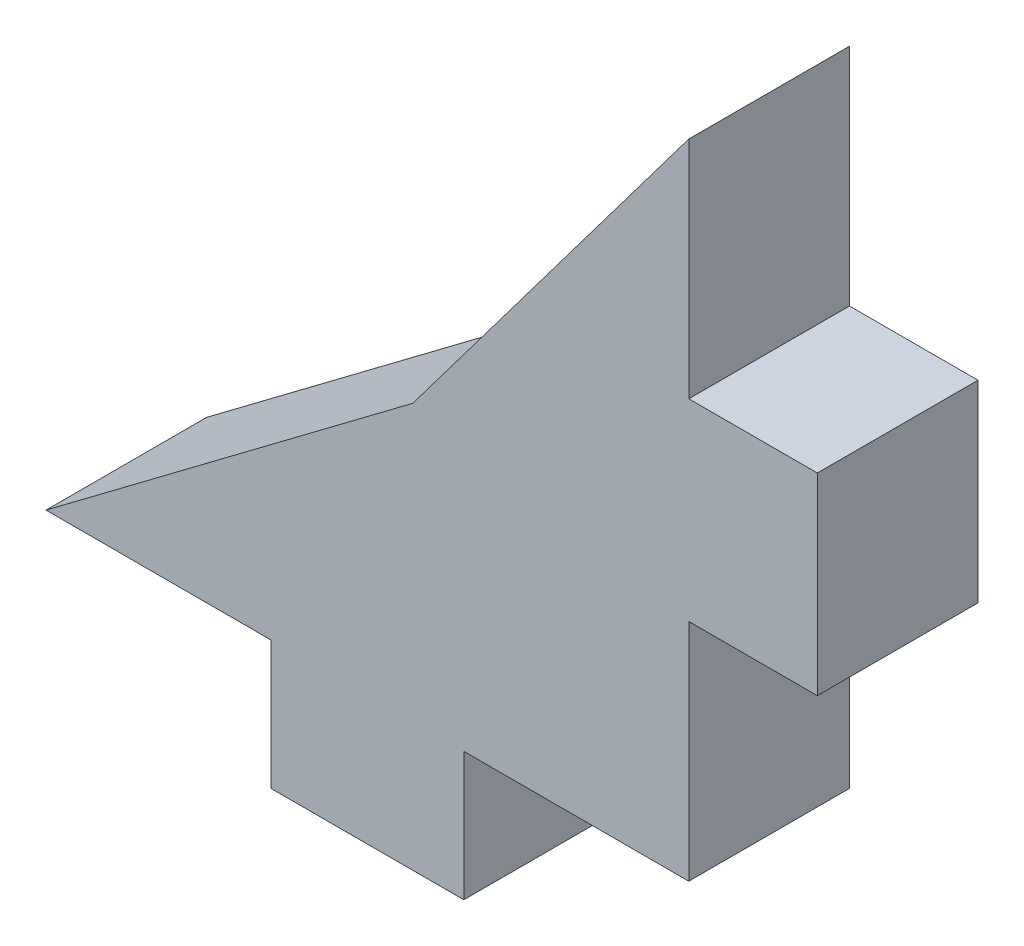
ISO-10303-21;
HEADER;
FILE_DESCRIPTION(('STEP AP214'),'2;1');
FILE_NAME('part.step','',(''),(''),'','','');
FILE_SCHEMA(('AUTOMOTIVE_DESIGN { 1 0 10303 214 1 1 1 1 }'));
ENDSEC;
DATA;
#1=APPLICATION_CONTEXT('core data for automotive mechanical design processes');
#2=APPLICATION_PROTOCOL_DEFINITION('international standard','automotive_design',2000,#1);
#3=PRODUCT_CONTEXT('',#1,'mechanical');
#4=PRODUCT('Part','Part','',(#3));
#5=PRODUCT_RELATED_PRODUCT_CATEGORY('part','',(#4));
#6=PRODUCT_DEFINITION_FORMATION('','',#4);
#7=PRODUCT_DEFINITION_CONTEXT('part definition',#1,'design');
#8=PRODUCT_DEFINITION('design','',#6,#7);
#9=PRODUCT_DEFINITION_SHAPE('','',#8);
#10=(LENGTH_UNIT() NAMED_UNIT(*) SI_UNIT(.MILLI.,.METRE.));
#11=(NAMED_UNIT(*) PLANE_ANGLE_UNIT() SI_UNIT($,.RADIAN.));
#12=(NAMED_UNIT(*) SI_UNIT($,.STERADIAN.) SOLID_ANGLE_UNIT());
#13=UNCERTAINTY_MEASURE_WITH_UNIT(LENGTH_MEASURE(1.E-05),#10,'distance_accuracy_value','');
#14=(GEOMETRIC_REPRESENTATION_CONTEXT(3) GLOBAL_UNCERTAINTY_ASSIGNED_CONTEXT((#13)) GLOBAL_UNIT_ASSIGNED_CONTEXT((#10,
#11,#12)) REPRESENTATION_CONTEXT('',''));
#15=CARTESIAN_POINT('',(0.,0.,0.));
#16=DIRECTION('',(0.,0.,1.));
#17=DIRECTION('',(1.,0.,0.));
#18=AXIS2_PLACEMENT_3D('',#15,#16,#17);
#19=CARTESIAN_POINT('',(0.,0.,5.));
#20=DIRECTION('',(0.,0.,1.));
#21=DIRECTION('',(1.,0.,0.));
#22=AXIS2_PLACEMENT_3D('',#19,#20,#21);
#23=PLANE('',#22);
#24=DIRECTION('',(-1.,0.,0.));
#25=VECTOR('',#24,1.);
#26=CARTESIAN_POINT('',(5.,7.,5.));
#27=LINE('',#26,#25);
#28=CARTESIAN_POINT('',(4.,7.,5.));
#29=VERTEX_POINT('',#28);
#30=CARTESIAN_POINT('',(0.,7.,5.));
#31=VERTEX_POINT('',#30);
#32=EDGE_CURVE('E153',#29,#31,#27,.T.);
#33=ORIENTED_EDGE('',*,*,#32,.F.);
#34=DIRECTION('',(0.,-1.,0.));
#35=VECTOR('',#34,1.);
#36=CARTESIAN_POINT('',(4.,13.,5.));
#37=LINE('',#36,#35);
#38=CARTESIAN_POINT('',(4.,13.,5.));
#39=VERTEX_POINT('',#38);
#40=EDGE_CURVE('E58',#39,#29,#37,.T.);
#41=ORIENTED_EDGE('',*,*,#40,.F.);
#42=DIRECTION('',(-1.,0.,0.));
#43=VECTOR('',#42,1.);
#44=CARTESIAN_POINT('',(5.,13.,5.));
#45=LINE('',#44,#43);
#46=CARTESIAN_POINT('',(0.,13.,5.));
#47=VERTEX_POINT('',#46);
#48=EDGE_CURVE('E157',#39,#47,#45,.T.);
#49=ORIENTED_EDGE('',*,*,#48,.T.);
#50=DIRECTION('',(0.,1.,0.));
#51=VECTOR('',#50,1.);
#52=CARTESIAN_POINT('',(0.,0.,5.));
#53=LINE('',#52,#51);
#54=CARTESIAN_POINT('',(0.,20.,5.));
#55=VERTEX_POINT('',#54);
#56=EDGE_CURVE('E211',#47,#55,#53,.T.);
#57=ORIENTED_EDGE('',*,*,#56,.T.);
#58=DIRECTION('',(0.601125287716338,0.799154796311672,0.));
#59=VECTOR('',#58,1.);
#60=CARTESIAN_POINT('',(-9.60784313725491,7.227032230641,5.));
#61=LINE('',#60,#59);
#62=CARTESIAN_POINT('',(-8.58578643762691,8.58578643762691,5.));
#63=VERTEX_POINT('',#62);
#64=EDGE_CURVE('E192',#63,#55,#61,.T.);
#65=ORIENTED_EDGE('',*,*,#64,.F.);
#66=DIRECTION('',(-0.799154796311672,-0.601125287716338,0.));
#67=VECTOR('',#66,1.);
#68=CARTESIAN_POINT('',(-7.22703223064099,9.60784313725491,5.));
#69=LINE('',#68,#67);
#70=CARTESIAN_POINT('',(-20.,0.,5.));
#71=VERTEX_POINT('',#70);
#72=EDGE_CURVE('E187',#63,#71,#69,.T.);
#73=ORIENTED_EDGE('',*,*,#72,.T.);
#74=DIRECTION('',(1.,0.,0.));
#75=VECTOR('',#74,1.);
#76=CARTESIAN_POINT('',(0.,0.,5.));
#77=LINE('',#76,#75);
#78=CARTESIAN_POINT('',(-13.,0.,5.));
#79=VERTEX_POINT('',#78);
#80=EDGE_CURVE('E212',#71,#79,#77,.T.);
#81=ORIENTED_EDGE('',*,*,#80,.T.);
#82=DIRECTION('',(0.,1.,0.));
#83=VECTOR('',#82,1.);
#84=CARTESIAN_POINT('',(-13.,-5.,5.));
#85=LINE('',#84,#83);
#86=CARTESIAN_POINT('',(-13.,-4.,5.));
#87=VERTEX_POINT('',#86);
#88=EDGE_CURVE('E179',#87,#79,#85,.T.);
#89=ORIENTED_EDGE('',*,*,#88,.F.);
#90=DIRECTION('',(-1.,0.,0.));
#91=VECTOR('',#90,1.);
#92=CARTESIAN_POINT('',(-7.,-4.,5.));
#93=LINE('',#92,#91);
#94=CARTESIAN_POINT('',(-7.,-4.,5.));
#95=VERTEX_POINT('',#94);
#96=EDGE_CURVE('E66',#95,#87,#93,.T.);
#97=ORIENTED_EDGE('',*,*,#96,.F.);
#98=DIRECTION('',(0.,1.,0.));
#99=VECTOR('',#98,1.);
#100=CARTESIAN_POINT('',(-7.,-5.,5.));
#101=LINE('',#100,#99);
#102=CARTESIAN_POINT('',(-7.,0.,5.));
#103=VERTEX_POINT('',#102);
#104=EDGE_CURVE('E182',#95,#103,#101,.T.);
#105=ORIENTED_EDGE('',*,*,#104,.T.);
#106=CARTESIAN_POINT('',(0.,0.,5.));
#107=VERTEX_POINT('',#106);
#108=EDGE_CURVE('E210',#103,#107,#77,.T.);
#109=ORIENTED_EDGE('',*,*,#108,.T.);
#110=EDGE_CURVE('E206',#107,#31,#53,.T.);
#111=ORIENTED_EDGE('',*,*,#110,.T.);
#112=EDGE_LOOP('',(#33,#41,#49,#57,#65,#73,#81,#89,#97,#105,#109,#111));
#113=FACE_BOUND('',#112,.T.);
#114=ADVANCED_FACE('F42',(#113),#23,.T.);
#115=CARTESIAN_POINT('',(0.,0.,0.));
#116=DIRECTION('',(0.,0.,1.));
#117=DIRECTION('',(1.,0.,0.));
#118=AXIS2_PLACEMENT_3D('',#115,#116,#117);
#119=PLANE('',#118);
#120=DIRECTION('',(0.,1.,0.));
#121=VECTOR('',#120,1.);
#122=CARTESIAN_POINT('',(4.,7.,0.));
#123=LINE('',#122,#121);
#124=CARTESIAN_POINT('',(4.,7.,0.));
#125=VERTEX_POINT('',#124);
#126=CARTESIAN_POINT('',(4.,13.,0.));
#127=VERTEX_POINT('',#126);
#128=EDGE_CURVE('E132',#125,#127,#123,.T.);
#129=ORIENTED_EDGE('',*,*,#128,.F.);
#130=DIRECTION('',(-1.,0.,0.));
#131=VECTOR('',#130,1.);
#132=CARTESIAN_POINT('',(5.,7.,0.));
#133=LINE('',#132,#131);
#134=CARTESIAN_POINT('',(0.,7.,0.));
#135=VERTEX_POINT('',#134);
#136=EDGE_CURVE('E142',#125,#135,#133,.T.);
#137=ORIENTED_EDGE('',*,*,#136,.T.);
#138=DIRECTION('',(0.,1.,0.));
#139=VECTOR('',#138,1.);
#140=CARTESIAN_POINT('',(0.,0.,0.));
#141=LINE('',#140,#139);
#142=CARTESIAN_POINT('',(0.,0.,0.));
#143=VERTEX_POINT('',#142);
#144=EDGE_CURVE('E217',#143,#135,#141,.T.);
#145=ORIENTED_EDGE('',*,*,#144,.F.);
#146=DIRECTION('',(1.,0.,0.));
#147=VECTOR('',#146,1.);
#148=CARTESIAN_POINT('',(0.,0.,0.));
#149=LINE('',#148,#147);
#150=CARTESIAN_POINT('',(-7.,0.,0.));
#151=VERTEX_POINT('',#150);
#152=EDGE_CURVE('E220',#151,#143,#149,.T.);
#153=ORIENTED_EDGE('',*,*,#152,.F.);
#154=DIRECTION('',(0.,1.,0.));
#155=VECTOR('',#154,1.);
#156=CARTESIAN_POINT('',(-7.,-5.,0.));
#157=LINE('',#156,#155);
#158=CARTESIAN_POINT('',(-7.,-4.,0.));
#159=VERTEX_POINT('',#158);
#160=EDGE_CURVE('E185',#159,#151,#157,.T.);
#161=ORIENTED_EDGE('',*,*,#160,.F.);
#162=DIRECTION('',(1.,0.,0.));
#163=VECTOR('',#162,1.);
#164=CARTESIAN_POINT('',(-13.,-4.,0.));
#165=LINE('',#164,#163);
#166=CARTESIAN_POINT('',(-13.,-4.,0.));
#167=VERTEX_POINT('',#166);
#168=EDGE_CURVE('E240',#167,#159,#165,.T.);
#169=ORIENTED_EDGE('',*,*,#168,.F.);
#170=DIRECTION('',(0.,1.,0.));
#171=VECTOR('',#170,1.);
#172=CARTESIAN_POINT('',(-13.,-5.,0.));
#173=LINE('',#172,#171);
#174=CARTESIAN_POINT('',(-13.,0.,0.));
#175=VERTEX_POINT('',#174);
#176=EDGE_CURVE('E176',#167,#175,#173,.T.);
#177=ORIENTED_EDGE('',*,*,#176,.T.);
#178=CARTESIAN_POINT('',(-20.,0.,0.));
#179=VERTEX_POINT('',#178);
#180=EDGE_CURVE('E221',#179,#175,#149,.T.);
#181=ORIENTED_EDGE('',*,*,#180,.F.);
#182=DIRECTION('',(-0.799154796311672,-0.601125287716338,0.));
#183=VECTOR('',#182,1.);
#184=CARTESIAN_POINT('',(-7.22703223064099,9.60784313725491,0.));
#185=LINE('',#184,#183);
#186=CARTESIAN_POINT('',(-8.58578643762691,8.58578643762691,0.));
#187=VERTEX_POINT('',#186);
#188=EDGE_CURVE('E188',#187,#179,#185,.T.);
#189=ORIENTED_EDGE('',*,*,#188,.F.);
#190=DIRECTION('',(0.601125287716338,0.799154796311672,0.));
#191=VECTOR('',#190,1.);
#192=CARTESIAN_POINT('',(-9.60784313725491,7.227032230641,0.));
#193=LINE('',#192,#191);
#194=CARTESIAN_POINT('',(0.,20.,0.));
#195=VERTEX_POINT('',#194);
#196=EDGE_CURVE('E191',#187,#195,#193,.T.);
#197=ORIENTED_EDGE('',*,*,#196,.T.);
#198=CARTESIAN_POINT('',(0.,13.,0.));
#199=VERTEX_POINT('',#198);
#200=EDGE_CURVE('E205',#199,#195,#141,.T.);
#201=ORIENTED_EDGE('',*,*,#200,.F.);
#202=DIRECTION('',(-1.,0.,0.));
#203=VECTOR('',#202,1.);
#204=CARTESIAN_POINT('',(5.,13.,0.));
#205=LINE('',#204,#203);
#206=EDGE_CURVE('E145',#127,#199,#205,.T.);
#207=ORIENTED_EDGE('',*,*,#206,.F.);
#208=EDGE_LOOP('',(#129,#137,#145,#153,#161,#169,#177,#181,#189,#197,#201,#207));
#209=FACE_BOUND('',#208,.T.);
#210=ADVANCED_FACE('F140',(#209),#119,.F.);
#211=CARTESIAN_POINT('',(5.,13.,5.));
#212=DIRECTION('',(0.,-1.,0.));
#213=DIRECTION('',(0.,0.,-1.));
#214=AXIS2_PLACEMENT_3D('',#211,#212,#213);
#215=PLANE('',#214);
#216=DIRECTION('',(0.,0.,1.));
#217=VECTOR('',#216,1.);
#218=CARTESIAN_POINT('',(4.,13.,0.));
#219=LINE('',#218,#217);
#220=EDGE_CURVE('E146',#127,#39,#219,.T.);
#221=ORIENTED_EDGE('',*,*,#220,.F.);
#222=ORIENTED_EDGE('',*,*,#206,.T.);
#223=DIRECTION('',(0.,0.,1.));
#224=VECTOR('',#223,1.);
#225=CARTESIAN_POINT('',(0.,13.,5.));
#226=LINE('',#225,#224);
#227=EDGE_CURVE('E160',#199,#47,#226,.T.);
#228=ORIENTED_EDGE('',*,*,#227,.T.);
#229=ORIENTED_EDGE('',*,*,#48,.F.);
#230=EDGE_LOOP('',(#221,#222,#228,#229));
#231=FACE_BOUND('',#230,.T.);
#232=ADVANCED_FACE('F267',(#231),#215,.F.);
#233=CARTESIAN_POINT('',(5.,7.,0.));
#234=DIRECTION('',(0.,1.,0.));
#235=DIRECTION('',(0.,0.,1.));
#236=AXIS2_PLACEMENT_3D('',#233,#234,#235);
#237=PLANE('',#236);
#238=DIRECTION('',(0.,0.,-1.));
#239=VECTOR('',#238,1.);
#240=CARTESIAN_POINT('',(4.,7.,5.));
#241=LINE('',#240,#239);
#242=EDGE_CURVE('E129',#29,#125,#241,.T.);
#243=ORIENTED_EDGE('',*,*,#242,.F.);
#244=ORIENTED_EDGE('',*,*,#32,.T.);
#245=DIRECTION('',(0.,0.,-1.));
#246=VECTOR('',#245,1.);
#247=CARTESIAN_POINT('',(0.,7.,0.));
#248=LINE('',#247,#246);
#249=EDGE_CURVE('E151',#31,#135,#248,.T.);
#250=ORIENTED_EDGE('',*,*,#249,.T.);
#251=ORIENTED_EDGE('',*,*,#136,.F.);
#252=EDGE_LOOP('',(#243,#244,#250,#251));
#253=FACE_BOUND('',#252,.T.);
#254=ADVANCED_FACE('F149',(#253),#237,.F.);
#255=CARTESIAN_POINT('',(-7.,-5.,5.));
#256=DIRECTION('',(-1.,0.,0.));
#257=DIRECTION('',(0.,0.,1.));
#258=AXIS2_PLACEMENT_3D('',#255,#256,#257);
#259=PLANE('',#258);
#260=DIRECTION('',(0.,0.,1.));
#261=VECTOR('',#260,1.);
#262=CARTESIAN_POINT('',(-7.,-4.,0.));
#263=LINE('',#262,#261);
#264=EDGE_CURVE('E260',#159,#95,#263,.T.);
#265=ORIENTED_EDGE('',*,*,#264,.F.);
#266=ORIENTED_EDGE('',*,*,#160,.T.);
#267=DIRECTION('',(0.,0.,1.));
#268=VECTOR('',#267,1.);
#269=CARTESIAN_POINT('',(-7.,0.,5.));
#270=LINE('',#269,#268);
#271=EDGE_CURVE('E168',#151,#103,#270,.T.);
#272=ORIENTED_EDGE('',*,*,#271,.T.);
#273=ORIENTED_EDGE('',*,*,#104,.F.);
#274=EDGE_LOOP('',(#265,#266,#272,#273));
#275=FACE_BOUND('',#274,.T.);
#276=ADVANCED_FACE('F274',(#275),#259,.F.);
#277=CARTESIAN_POINT('',(-13.,-5.,0.));
#278=DIRECTION('',(1.,0.,0.));
#279=DIRECTION('',(0.,0.,-1.));
#280=AXIS2_PLACEMENT_3D('',#277,#278,#279);
#281=PLANE('',#280);
#282=DIRECTION('',(0.,0.,-1.));
#283=VECTOR('',#282,1.);
#284=CARTESIAN_POINT('',(-13.,-4.,5.));
#285=LINE('',#284,#283);
#286=EDGE_CURVE('E243',#87,#167,#285,.T.);
#287=ORIENTED_EDGE('',*,*,#286,.F.);
#288=ORIENTED_EDGE('',*,*,#88,.T.);
#289=DIRECTION('',(0.,0.,-1.));
#290=VECTOR('',#289,1.);
#291=CARTESIAN_POINT('',(-13.,0.,0.));
#292=LINE('',#291,#290);
#293=EDGE_CURVE('E172',#79,#175,#292,.T.);
#294=ORIENTED_EDGE('',*,*,#293,.T.);
#295=ORIENTED_EDGE('',*,*,#176,.F.);
#296=EDGE_LOOP('',(#287,#288,#294,#295));
#297=FACE_BOUND('',#296,.T.);
#298=ADVANCED_FACE('F242',(#297),#281,.F.);
#299=CARTESIAN_POINT('',(0.,0.,5.));
#300=DIRECTION('',(-1.,0.,0.));
#301=DIRECTION('',(0.,0.,1.));
#302=AXIS2_PLACEMENT_3D('',#299,#300,#301);
#303=PLANE('',#302);
#304=ORIENTED_EDGE('',*,*,#227,.F.);
#305=ORIENTED_EDGE('',*,*,#200,.T.);
#306=DIRECTION('',(0.,0.,-1.));
#307=VECTOR('',#306,1.);
#308=CARTESIAN_POINT('',(0.,20.,5.));
#309=LINE('',#308,#307);
#310=EDGE_CURVE('E11',#55,#195,#309,.T.);
#311=ORIENTED_EDGE('',*,*,#310,.F.);
#312=ORIENTED_EDGE('',*,*,#56,.F.);
#313=EDGE_LOOP('',(#304,#305,#311,#312));
#314=FACE_BOUND('',#313,.T.);
#315=ADVANCED_FACE('F44',(#314),#303,.F.);
#316=ORIENTED_EDGE('',*,*,#249,.F.);
#317=ORIENTED_EDGE('',*,*,#110,.F.);
#318=DIRECTION('',(0.,0.,-1.));
#319=VECTOR('',#318,1.);
#320=CARTESIAN_POINT('',(0.,0.,5.));
#321=LINE('',#320,#319);
#322=EDGE_CURVE('E216',#107,#143,#321,.T.);
#323=ORIENTED_EDGE('',*,*,#322,.T.);
#324=ORIENTED_EDGE('',*,*,#144,.T.);
#325=EDGE_LOOP('',(#316,#317,#323,#324));
#326=FACE_BOUND('',#325,.T.);
#327=ADVANCED_FACE('F286',(#326),#303,.F.);
#328=CARTESIAN_POINT('',(0.,0.,5.));
#329=DIRECTION('',(0.,1.,0.));
#330=DIRECTION('',(0.,0.,1.));
#331=AXIS2_PLACEMENT_3D('',#328,#329,#330);
#332=PLANE('',#331);
#333=ORIENTED_EDGE('',*,*,#271,.F.);
#334=ORIENTED_EDGE('',*,*,#152,.T.);
#335=ORIENTED_EDGE('',*,*,#322,.F.);
#336=ORIENTED_EDGE('',*,*,#108,.F.);
#337=EDGE_LOOP('',(#333,#334,#335,#336));
#338=FACE_BOUND('',#337,.T.);
#339=ADVANCED_FACE('F284',(#338),#332,.F.);
#340=ORIENTED_EDGE('',*,*,#293,.F.);
#341=ORIENTED_EDGE('',*,*,#80,.F.);
#342=DIRECTION('',(0.,0.,-1.));
#343=VECTOR('',#342,1.);
#344=CARTESIAN_POINT('',(-20.,0.,5.));
#345=LINE('',#344,#343);
#346=EDGE_CURVE('E51',#71,#179,#345,.T.);
#347=ORIENTED_EDGE('',*,*,#346,.T.);
#348=ORIENTED_EDGE('',*,*,#180,.T.);
#349=EDGE_LOOP('',(#340,#341,#347,#348));
#350=FACE_BOUND('',#349,.T.);
#351=ADVANCED_FACE('F233',(#350),#332,.F.);
#352=CARTESIAN_POINT('',(-7.22703223064099,9.60784313725491,0.));
#353=DIRECTION('',(-0.601125287716338,0.799154796311672,0.));
#354=DIRECTION('',(-0.799154796311672,-0.601125287716338,0.));
#355=AXIS2_PLACEMENT_3D('',#352,#353,#354);
#356=PLANE('',#355);
#357=ORIENTED_EDGE('',*,*,#72,.F.);
#358=DIRECTION('',(0.,0.,1.));
#359=VECTOR('',#358,1.);
#360=CARTESIAN_POINT('',(-8.58578643762691,8.58578643762691,0.));
#361=LINE('',#360,#359);
#362=EDGE_CURVE('E196',#187,#63,#361,.T.);
#363=ORIENTED_EDGE('',*,*,#362,.F.);
#364=ORIENTED_EDGE('',*,*,#188,.T.);
#365=ORIENTED_EDGE('',*,*,#346,.F.);
#366=EDGE_LOOP('',(#357,#363,#364,#365));
#367=FACE_BOUND('',#366,.T.);
#368=ADVANCED_FACE('F247',(#367),#356,.T.);
#369=CARTESIAN_POINT('',(-9.60784313725491,7.227032230641,0.));
#370=DIRECTION('',(0.799154796311672,-0.601125287716338,0.));
#371=DIRECTION('',(0.601125287716338,0.799154796311672,0.));
#372=AXIS2_PLACEMENT_3D('',#369,#370,#371);
#373=PLANE('',#372);
#374=ORIENTED_EDGE('',*,*,#64,.T.);
#375=ORIENTED_EDGE('',*,*,#310,.T.);
#376=ORIENTED_EDGE('',*,*,#196,.F.);
#377=ORIENTED_EDGE('',*,*,#362,.T.);
#378=EDGE_LOOP('',(#374,#375,#376,#377));
#379=FACE_BOUND('',#378,.T.);
#380=ADVANCED_FACE('F250',(#379),#373,.F.);
#381=CARTESIAN_POINT('',(0.,-4.,0.));
#382=DIRECTION('',(0.,-1.,0.));
#383=DIRECTION('',(0.,0.,-1.));
#384=AXIS2_PLACEMENT_3D('',#381,#382,#383);
#385=PLANE('',#384);
#386=ORIENTED_EDGE('',*,*,#286,.T.);
#387=ORIENTED_EDGE('',*,*,#168,.T.);
#388=ORIENTED_EDGE('',*,*,#264,.T.);
#389=ORIENTED_EDGE('',*,*,#96,.T.);
#390=EDGE_LOOP('',(#386,#387,#388,#389));
#391=FACE_BOUND('',#390,.T.);
#392=ADVANCED_FACE('F304',(#391),#385,.T.);
#393=CARTESIAN_POINT('',(4.,0.,0.));
#394=DIRECTION('',(1.,0.,0.));
#395=DIRECTION('',(0.,0.,-1.));
#396=AXIS2_PLACEMENT_3D('',#393,#394,#395);
#397=PLANE('',#396);
#398=ORIENTED_EDGE('',*,*,#242,.T.);
#399=ORIENTED_EDGE('',*,*,#128,.T.);
#400=ORIENTED_EDGE('',*,*,#220,.T.);
#401=ORIENTED_EDGE('',*,*,#40,.T.);
#402=EDGE_LOOP('',(#398,#399,#400,#401));
#403=FACE_BOUND('',#402,.T.);
#404=ADVANCED_FACE('F131',(#403),#397,.T.);
#405=CLOSED_SHELL('',(#114,#210,#232,#254,#276,#298,#315,#327,#339,#351,#368,#380,#392,#404));
#406=MANIFOLD_SOLID_BREP('B2',#405);
#407=ADVANCED_BREP_SHAPE_REPRESENTATION('',(#18,#406),#14);
#408=SHAPE_DEFINITION_REPRESENTATION(#9,#407);
ENDSEC;
END-ISO-10303-21;
